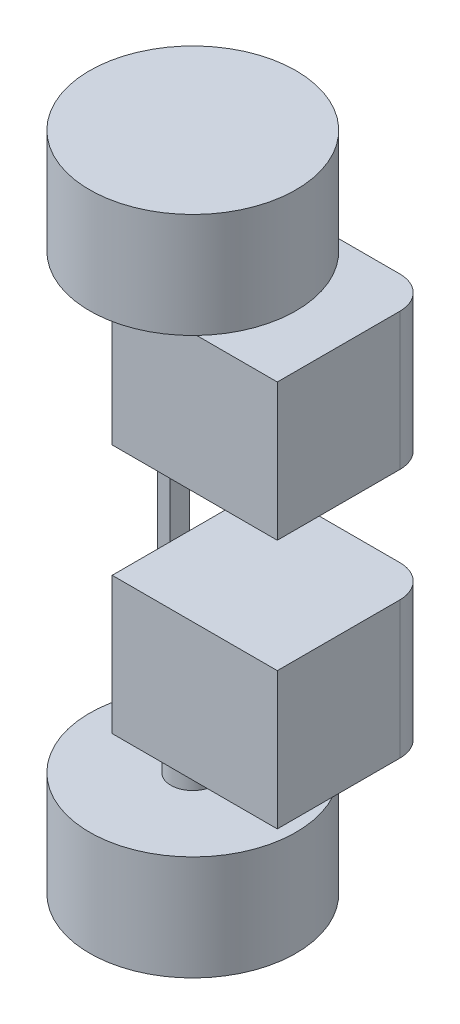
ISO-10303-21;
HEADER;
FILE_DESCRIPTION(('STEP AP214'),'2;1');
FILE_NAME('part.step','',(''),(''),'','','');
FILE_SCHEMA(('AUTOMOTIVE_DESIGN { 1 0 10303 214 1 1 1 1 }'));
ENDSEC;
DATA;
#1=APPLICATION_CONTEXT('core data for automotive mechanical design processes');
#2=APPLICATION_PROTOCOL_DEFINITION('international standard','automotive_design',2000,#1);
#3=PRODUCT_CONTEXT('',#1,'mechanical');
#4=PRODUCT('Part','Part','',(#3));
#5=PRODUCT_RELATED_PRODUCT_CATEGORY('part','',(#4));
#6=PRODUCT_DEFINITION_FORMATION('','',#4);
#7=PRODUCT_DEFINITION_CONTEXT('part definition',#1,'design');
#8=PRODUCT_DEFINITION('design','',#6,#7);
#9=PRODUCT_DEFINITION_SHAPE('','',#8);
#10=(LENGTH_UNIT() NAMED_UNIT(*) SI_UNIT(.MILLI.,.METRE.));
#11=(NAMED_UNIT(*) PLANE_ANGLE_UNIT() SI_UNIT($,.RADIAN.));
#12=(NAMED_UNIT(*) SI_UNIT($,.STERADIAN.) SOLID_ANGLE_UNIT());
#13=UNCERTAINTY_MEASURE_WITH_UNIT(LENGTH_MEASURE(1.E-05),#10,'distance_accuracy_value','');
#14=(GEOMETRIC_REPRESENTATION_CONTEXT(3) GLOBAL_UNCERTAINTY_ASSIGNED_CONTEXT((#13)) GLOBAL_UNIT_ASSIGNED_CONTEXT((#10,
#11,#12)) REPRESENTATION_CONTEXT('',''));
#15=CARTESIAN_POINT('',(0.,0.,0.));
#16=DIRECTION('',(0.,0.,1.));
#17=DIRECTION('',(1.,0.,0.));
#18=AXIS2_PLACEMENT_3D('',#15,#16,#17);
#19=CARTESIAN_POINT('',(0.,0.,0.));
#20=DIRECTION('',(1.,0.,0.));
#21=DIRECTION('',(0.,0.,-1.));
#22=AXIS2_PLACEMENT_3D('',#19,#20,#21);
#23=PLANE('',#22);
#24=DIRECTION('',(0.,1.,0.));
#25=VECTOR('',#24,1.);
#26=CARTESIAN_POINT('',(0.,0.,-18.));
#27=LINE('',#26,#25);
#28=CARTESIAN_POINT('',(0.,42.5,-18.));
#29=VERTEX_POINT('',#28);
#30=CARTESIAN_POINT('',(0.,77.5,-18.));
#31=VERTEX_POINT('',#30);
#32=EDGE_CURVE('E47',#29,#31,#27,.T.);
#33=ORIENTED_EDGE('',*,*,#32,.F.);
#34=DIRECTION('',(0.,0.,1.));
#35=VECTOR('',#34,1.);
#36=CARTESIAN_POINT('',(0.,42.5,-48.));
#37=LINE('',#36,#35);
#38=CARTESIAN_POINT('',(0.,42.5,-24.));
#39=VERTEX_POINT('',#38);
#40=EDGE_CURVE('E587',#39,#29,#37,.T.);
#41=ORIENTED_EDGE('',*,*,#40,.F.);
#42=DIRECTION('',(0.,-1.,0.));
#43=VECTOR('',#42,1.);
#44=CARTESIAN_POINT('',(0.,0.,-24.));
#45=LINE('',#44,#43);
#46=CARTESIAN_POINT('',(0.,77.5,-24.));
#47=VERTEX_POINT('',#46);
#48=EDGE_CURVE('E208',#47,#39,#45,.T.);
#49=ORIENTED_EDGE('',*,*,#48,.F.);
#50=DIRECTION('',(0.,0.,-1.));
#51=VECTOR('',#50,1.);
#52=CARTESIAN_POINT('',(0.,77.5,-48.));
#53=LINE('',#52,#51);
#54=EDGE_CURVE('E229',#31,#47,#53,.T.);
#55=ORIENTED_EDGE('',*,*,#54,.F.);
#56=EDGE_LOOP('',(#33,#41,#49,#55));
#57=FACE_BOUND('',#56,.T.);
#58=ADVANCED_FACE('F36',(#57),#23,.T.);
#59=CARTESIAN_POINT('',(0.,120.,0.));
#60=DIRECTION('',(1.,0.,0.));
#61=DIRECTION('',(0.,0.,-1.));
#62=AXIS2_PLACEMENT_3D('',#59,#60,#61);
#63=PLANE('',#62);
#64=CARTESIAN_POINT('',(0.,120.,-18.));
#65=VERTEX_POINT('',#64);
#66=EDGE_CURVE('E11',#31,#65,#27,.T.);
#67=ORIENTED_EDGE('',*,*,#66,.F.);
#68=CARTESIAN_POINT('',(0.,77.5,0.));
#69=VERTEX_POINT('',#68);
#70=EDGE_CURVE('E226',#69,#31,#53,.T.);
#71=ORIENTED_EDGE('',*,*,#70,.F.);
#72=DIRECTION('',(0.,-1.,0.));
#73=VECTOR('',#72,1.);
#74=CARTESIAN_POINT('',(0.,120.,0.));
#75=LINE('',#74,#73);
#76=CARTESIAN_POINT('',(0.,120.,0.));
#77=VERTEX_POINT('',#76);
#78=EDGE_CURVE('E261',#77,#69,#75,.T.);
#79=ORIENTED_EDGE('',*,*,#78,.F.);
#80=DIRECTION('',(0.,0.,1.));
#81=VECTOR('',#80,1.);
#82=CARTESIAN_POINT('',(0.,120.,0.));
#83=LINE('',#82,#81);
#84=EDGE_CURVE('E54',#65,#77,#83,.T.);
#85=ORIENTED_EDGE('',*,*,#84,.F.);
#86=EDGE_LOOP('',(#67,#71,#79,#85));
#87=FACE_BOUND('',#86,.T.);
#88=ADVANCED_FACE('F305',(#87),#63,.F.);
#89=CARTESIAN_POINT('',(0.,120.,-24.));
#90=VERTEX_POINT('',#89);
#91=EDGE_CURVE('E61',#90,#47,#45,.T.);
#92=ORIENTED_EDGE('',*,*,#91,.F.);
#93=CARTESIAN_POINT('',(0.,120.,-48.));
#94=VERTEX_POINT('',#93);
#95=EDGE_CURVE('E246',#94,#90,#83,.T.);
#96=ORIENTED_EDGE('',*,*,#95,.F.);
#97=DIRECTION('',(0.,-1.,0.));
#98=VECTOR('',#97,1.);
#99=CARTESIAN_POINT('',(0.,120.,-48.));
#100=LINE('',#99,#98);
#101=CARTESIAN_POINT('',(0.,77.5,-48.));
#102=VERTEX_POINT('',#101);
#103=EDGE_CURVE('E255',#94,#102,#100,.T.);
#104=ORIENTED_EDGE('',*,*,#103,.T.);
#105=EDGE_CURVE('E221',#47,#102,#53,.T.);
#106=ORIENTED_EDGE('',*,*,#105,.F.);
#107=EDGE_LOOP('',(#92,#96,#104,#106));
#108=FACE_BOUND('',#107,.T.);
#109=ADVANCED_FACE('F310',(#108),#63,.F.);
#110=CARTESIAN_POINT('',(13.,162.5,-12.));
#111=DIRECTION('',(0.,1.,0.));
#112=DIRECTION('',(0.,0.,-1.));
#113=AXIS2_PLACEMENT_3D('',#110,#111,#112);
#114=PLANE('',#113);
#115=CARTESIAN_POINT('',(13.,162.5,-12.));
#116=DIRECTION('',(0.,-1.,0.));
#117=DIRECTION('',(0.,0.,-1.));
#118=AXIS2_PLACEMENT_3D('',#115,#116,#117);
#119=CIRCLE('',#118,32.);
#120=CARTESIAN_POINT('',(13.,162.5,-44.));
#121=VERTEX_POINT('',#120);
#122=EDGE_CURVE('E235',#121,#121,#119,.T.);
#123=ORIENTED_EDGE('',*,*,#122,.F.);
#124=EDGE_LOOP('',(#123));
#125=FACE_BOUND('',#124,.T.);
#126=ADVANCED_FACE('F312',(#125),#114,.T.);
#127=CARTESIAN_POINT('',(13.,162.5,-12.));
#128=DIRECTION('',(0.,-1.,0.));
#129=DIRECTION('',(0.,0.,-1.));
#130=AXIS2_PLACEMENT_3D('',#127,#128,#129);
#131=CYLINDRICAL_SURFACE('',#130,32.);
#132=ORIENTED_EDGE('',*,*,#122,.T.);
#133=EDGE_LOOP('',(#132));
#134=FACE_BOUND('',#133,.T.);
#135=CARTESIAN_POINT('',(13.,130.,-12.));
#136=DIRECTION('',(0.,-1.,0.));
#137=DIRECTION('',(0.,0.,-1.));
#138=AXIS2_PLACEMENT_3D('',#135,#136,#137);
#139=CIRCLE('',#138,32.);
#140=CARTESIAN_POINT('',(13.,130.,-44.));
#141=VERTEX_POINT('',#140);
#142=EDGE_CURVE('E233',#141,#141,#139,.T.);
#143=ORIENTED_EDGE('',*,*,#142,.F.);
#144=EDGE_LOOP('',(#143));
#145=FACE_BOUND('',#144,.T.);
#146=ADVANCED_FACE('F317',(#134,#145),#131,.T.);
#147=CARTESIAN_POINT('',(13.,130.,-12.));
#148=DIRECTION('',(0.,1.,0.));
#149=DIRECTION('',(0.,0.,-1.));
#150=AXIS2_PLACEMENT_3D('',#147,#148,#149);
#151=PLANE('',#150);
#152=CARTESIAN_POINT('',(13.,130.,-12.));
#153=DIRECTION('',(0.,-1.,0.));
#154=DIRECTION('',(0.,0.,-1.));
#155=AXIS2_PLACEMENT_3D('',#152,#153,#154);
#156=CIRCLE('',#155,6.80386416884808);
#157=CARTESIAN_POINT('',(13.,130.,-18.8038641688481));
#158=VERTEX_POINT('',#157);
#159=EDGE_CURVE('E238',#158,#158,#156,.T.);
#160=ORIENTED_EDGE('',*,*,#159,.F.);
#161=EDGE_LOOP('',(#160));
#162=FACE_BOUND('',#161,.T.);
#163=ORIENTED_EDGE('',*,*,#142,.T.);
#164=EDGE_LOOP('',(#163));
#165=FACE_BOUND('',#164,.T.);
#166=ADVANCED_FACE('F339',(#162,#165),#151,.F.);
#167=CARTESIAN_POINT('',(13.,130.,-12.));
#168=DIRECTION('',(0.,-1.,0.));
#169=DIRECTION('',(0.,0.,-1.));
#170=AXIS2_PLACEMENT_3D('',#167,#168,#169);
#171=CYLINDRICAL_SURFACE('',#170,6.80386416884808);
#172=ORIENTED_EDGE('',*,*,#159,.T.);
#173=EDGE_LOOP('',(#172));
#174=FACE_BOUND('',#173,.T.);
#175=CARTESIAN_POINT('',(13.,120.,-12.));
#176=DIRECTION('',(0.,-1.,0.));
#177=DIRECTION('',(0.,0.,-1.));
#178=AXIS2_PLACEMENT_3D('',#175,#176,#177);
#179=CIRCLE('',#178,6.80386416884808);
#180=CARTESIAN_POINT('',(13.,120.,-18.8038641688481));
#181=VERTEX_POINT('',#180);
#182=EDGE_CURVE('E243',#181,#181,#179,.T.);
#183=ORIENTED_EDGE('',*,*,#182,.F.);
#184=EDGE_LOOP('',(#183));
#185=FACE_BOUND('',#184,.T.);
#186=ADVANCED_FACE('F342',(#174,#185),#171,.T.);
#187=CARTESIAN_POINT('',(0.,120.,0.));
#188=DIRECTION('',(0.,-1.,0.));
#189=DIRECTION('',(0.,0.,-1.));
#190=AXIS2_PLACEMENT_3D('',#187,#188,#189);
#191=PLANE('',#190);
#192=ORIENTED_EDGE('',*,*,#182,.T.);
#193=EDGE_LOOP('',(#192));
#194=FACE_BOUND('',#193,.T.);
#195=DIRECTION('',(0.,0.,-1.));
#196=VECTOR('',#195,1.);
#197=CARTESIAN_POINT('',(51.2,120.,0.));
#198=LINE('',#197,#196);
#199=CARTESIAN_POINT('',(51.2,120.,0.));
#200=VERTEX_POINT('',#199);
#201=CARTESIAN_POINT('',(51.2,120.,-38.));
#202=VERTEX_POINT('',#201);
#203=EDGE_CURVE('E250',#200,#202,#198,.T.);
#204=ORIENTED_EDGE('',*,*,#203,.T.);
#205=CARTESIAN_POINT('',(41.2,120.,-38.));
#206=DIRECTION('',(0.,-1.,0.));
#207=DIRECTION('',(0.,0.,-1.));
#208=AXIS2_PLACEMENT_3D('',#205,#206,#207);
#209=CIRCLE('',#208,10.);
#210=CARTESIAN_POINT('',(41.2,120.,-48.));
#211=VERTEX_POINT('',#210);
#212=EDGE_CURVE('E268',#202,#211,#209,.F.);
#213=ORIENTED_EDGE('',*,*,#212,.T.);
#214=DIRECTION('',(-1.,0.,0.));
#215=VECTOR('',#214,1.);
#216=CARTESIAN_POINT('',(0.,120.,-48.));
#217=LINE('',#216,#215);
#218=EDGE_CURVE('E253',#211,#94,#217,.T.);
#219=ORIENTED_EDGE('',*,*,#218,.T.);
#220=ORIENTED_EDGE('',*,*,#95,.T.);
#221=DIRECTION('',(1.,0.,0.));
#222=VECTOR('',#221,1.);
#223=CARTESIAN_POINT('',(-4.,120.,-24.));
#224=LINE('',#223,#222);
#225=CARTESIAN_POINT('',(-4.,120.,-24.));
#226=VERTEX_POINT('',#225);
#227=EDGE_CURVE('E215',#226,#90,#224,.T.);
#228=ORIENTED_EDGE('',*,*,#227,.F.);
#229=DIRECTION('',(0.,0.,-1.));
#230=VECTOR('',#229,1.);
#231=CARTESIAN_POINT('',(-4.,120.,-24.));
#232=LINE('',#231,#230);
#233=CARTESIAN_POINT('',(-4.,120.,-18.));
#234=VERTEX_POINT('',#233);
#235=EDGE_CURVE('E200',#234,#226,#232,.T.);
#236=ORIENTED_EDGE('',*,*,#235,.F.);
#237=DIRECTION('',(1.,0.,0.));
#238=VECTOR('',#237,1.);
#239=CARTESIAN_POINT('',(-4.,120.,-18.));
#240=LINE('',#239,#238);
#241=EDGE_CURVE('E218',#234,#65,#240,.T.);
#242=ORIENTED_EDGE('',*,*,#241,.T.);
#243=ORIENTED_EDGE('',*,*,#84,.T.);
#244=DIRECTION('',(1.,0.,0.));
#245=VECTOR('',#244,1.);
#246=CARTESIAN_POINT('',(0.,120.,0.));
#247=LINE('',#246,#245);
#248=EDGE_CURVE('E248',#77,#200,#247,.T.);
#249=ORIENTED_EDGE('',*,*,#248,.T.);
#250=EDGE_LOOP('',(#204,#213,#219,#220,#228,#236,#242,#243,#249));
#251=FACE_BOUND('',#250,.T.);
#252=ADVANCED_FACE('F286',(#194,#251),#191,.F.);
#253=CARTESIAN_POINT('',(41.2,120.,-38.));
#254=DIRECTION('',(0.,-1.,0.));
#255=DIRECTION('',(0.,0.,-1.));
#256=AXIS2_PLACEMENT_3D('',#253,#254,#255);
#257=CYLINDRICAL_SURFACE('',#256,10.);
#258=CARTESIAN_POINT('',(41.2,77.5,-38.));
#259=DIRECTION('',(0.,1.,0.));
#260=DIRECTION('',(0.,0.,1.));
#261=AXIS2_PLACEMENT_3D('',#258,#259,#260);
#262=CIRCLE('',#261,10.);
#263=CARTESIAN_POINT('',(41.2,77.5,-48.));
#264=VERTEX_POINT('',#263);
#265=CARTESIAN_POINT('',(51.2,77.5,-38.));
#266=VERTEX_POINT('',#265);
#267=EDGE_CURVE('E40',#264,#266,#262,.F.);
#268=ORIENTED_EDGE('',*,*,#267,.F.);
#269=DIRECTION('',(0.,-1.,0.));
#270=VECTOR('',#269,1.);
#271=CARTESIAN_POINT('',(41.2,120.,-48.));
#272=LINE('',#271,#270);
#273=EDGE_CURVE('E264',#211,#264,#272,.T.);
#274=ORIENTED_EDGE('',*,*,#273,.F.);
#275=ORIENTED_EDGE('',*,*,#212,.F.);
#276=DIRECTION('',(0.,-1.,0.));
#277=VECTOR('',#276,1.);
#278=CARTESIAN_POINT('',(51.2,120.,-38.));
#279=LINE('',#278,#277);
#280=EDGE_CURVE('E267',#266,#202,#279,.F.);
#281=ORIENTED_EDGE('',*,*,#280,.F.);
#282=EDGE_LOOP('',(#268,#274,#275,#281));
#283=FACE_BOUND('',#282,.T.);
#284=ADVANCED_FACE('F38',(#283),#257,.T.);
#285=CARTESIAN_POINT('',(0.,120.,-48.));
#286=DIRECTION('',(0.,0.,1.));
#287=DIRECTION('',(1.,0.,0.));
#288=AXIS2_PLACEMENT_3D('',#285,#286,#287);
#289=PLANE('',#288);
#290=ORIENTED_EDGE('',*,*,#273,.T.);
#291=DIRECTION('',(-1.,0.,0.));
#292=VECTOR('',#291,1.);
#293=CARTESIAN_POINT('',(51.2,77.5,-48.));
#294=LINE('',#293,#292);
#295=EDGE_CURVE('E230',#264,#102,#294,.T.);
#296=ORIENTED_EDGE('',*,*,#295,.T.);
#297=ORIENTED_EDGE('',*,*,#103,.F.);
#298=ORIENTED_EDGE('',*,*,#218,.F.);
#299=EDGE_LOOP('',(#290,#296,#297,#298));
#300=FACE_BOUND('',#299,.T.);
#301=ADVANCED_FACE('F284',(#300),#289,.F.);
#302=CARTESIAN_POINT('',(51.2,120.,0.));
#303=DIRECTION('',(-1.,0.,0.));
#304=DIRECTION('',(0.,0.,1.));
#305=AXIS2_PLACEMENT_3D('',#302,#303,#304);
#306=PLANE('',#305);
#307=DIRECTION('',(0.,-1.,0.));
#308=VECTOR('',#307,1.);
#309=CARTESIAN_POINT('',(51.2,120.,0.));
#310=LINE('',#309,#308);
#311=CARTESIAN_POINT('',(51.2,77.5,0.));
#312=VERTEX_POINT('',#311);
#313=EDGE_CURVE('E258',#200,#312,#310,.T.);
#314=ORIENTED_EDGE('',*,*,#313,.T.);
#315=DIRECTION('',(0.,0.,-1.));
#316=VECTOR('',#315,1.);
#317=CARTESIAN_POINT('',(51.2,77.5,-48.));
#318=LINE('',#317,#316);
#319=EDGE_CURVE('E222',#312,#266,#318,.T.);
#320=ORIENTED_EDGE('',*,*,#319,.T.);
#321=ORIENTED_EDGE('',*,*,#280,.T.);
#322=ORIENTED_EDGE('',*,*,#203,.F.);
#323=EDGE_LOOP('',(#314,#320,#321,#322));
#324=FACE_BOUND('',#323,.T.);
#325=ADVANCED_FACE('F280',(#324),#306,.F.);
#326=CARTESIAN_POINT('',(0.,120.,0.));
#327=DIRECTION('',(0.,0.,-1.));
#328=DIRECTION('',(-1.,0.,0.));
#329=AXIS2_PLACEMENT_3D('',#326,#327,#328);
#330=PLANE('',#329);
#331=ORIENTED_EDGE('',*,*,#78,.T.);
#332=DIRECTION('',(-1.,0.,0.));
#333=VECTOR('',#332,1.);
#334=CARTESIAN_POINT('',(51.2,77.5,0.));
#335=LINE('',#334,#333);
#336=EDGE_CURVE('E225',#312,#69,#335,.T.);
#337=ORIENTED_EDGE('',*,*,#336,.F.);
#338=ORIENTED_EDGE('',*,*,#313,.F.);
#339=ORIENTED_EDGE('',*,*,#248,.F.);
#340=EDGE_LOOP('',(#331,#337,#338,#339));
#341=FACE_BOUND('',#340,.T.);
#342=ADVANCED_FACE('F337',(#341),#330,.F.);
#343=CARTESIAN_POINT('',(51.2,77.5,-48.));
#344=DIRECTION('',(0.,1.,0.));
#345=DIRECTION('',(0.,0.,1.));
#346=AXIS2_PLACEMENT_3D('',#343,#344,#345);
#347=PLANE('',#346);
#348=ORIENTED_EDGE('',*,*,#267,.T.);
#349=ORIENTED_EDGE('',*,*,#319,.F.);
#350=ORIENTED_EDGE('',*,*,#336,.T.);
#351=ORIENTED_EDGE('',*,*,#70,.T.);
#352=ORIENTED_EDGE('',*,*,#54,.T.);
#353=ORIENTED_EDGE('',*,*,#105,.T.);
#354=ORIENTED_EDGE('',*,*,#295,.F.);
#355=EDGE_LOOP('',(#348,#349,#350,#351,#352,#353,#354));
#356=FACE_BOUND('',#355,.T.);
#357=ADVANCED_FACE('F274',(#356),#347,.F.);
#358=CARTESIAN_POINT('',(-4.,0.,-18.));
#359=DIRECTION('',(0.,0.,-1.));
#360=DIRECTION('',(-1.,0.,0.));
#361=AXIS2_PLACEMENT_3D('',#358,#359,#360);
#362=PLANE('',#361);
#363=CARTESIAN_POINT('',(0.,0.,-18.));
#364=VERTEX_POINT('',#363);
#365=EDGE_CURVE('E46',#364,#29,#27,.T.);
#366=ORIENTED_EDGE('',*,*,#365,.T.);
#367=ORIENTED_EDGE('',*,*,#32,.T.);
#368=ORIENTED_EDGE('',*,*,#66,.T.);
#369=ORIENTED_EDGE('',*,*,#241,.F.);
#370=DIRECTION('',(0.,1.,0.));
#371=VECTOR('',#370,1.);
#372=CARTESIAN_POINT('',(-4.,0.,-18.));
#373=LINE('',#372,#371);
#374=CARTESIAN_POINT('',(-4.,0.,-18.));
#375=VERTEX_POINT('',#374);
#376=EDGE_CURVE('E197',#375,#234,#373,.T.);
#377=ORIENTED_EDGE('',*,*,#376,.F.);
#378=DIRECTION('',(1.,0.,0.));
#379=VECTOR('',#378,1.);
#380=CARTESIAN_POINT('',(-4.,0.,-18.));
#381=LINE('',#380,#379);
#382=EDGE_CURVE('E205',#375,#364,#381,.T.);
#383=ORIENTED_EDGE('',*,*,#382,.T.);
#384=EDGE_LOOP('',(#366,#367,#368,#369,#377,#383));
#385=FACE_BOUND('',#384,.T.);
#386=ADVANCED_FACE('F302',(#385),#362,.F.);
#387=CARTESIAN_POINT('',(-4.,0.,-24.));
#388=DIRECTION('',(0.,0.,1.));
#389=DIRECTION('',(0.,-1.,0.));
#390=AXIS2_PLACEMENT_3D('',#387,#388,#389);
#391=PLANE('',#390);
#392=ORIENTED_EDGE('',*,*,#91,.T.);
#393=ORIENTED_EDGE('',*,*,#48,.T.);
#394=DIRECTION('',(0.,1.,0.));
#395=VECTOR('',#394,1.);
#396=CARTESIAN_POINT('',(0.,0.,-24.));
#397=LINE('',#396,#395);
#398=CARTESIAN_POINT('',(0.,0.,-24.));
#399=VERTEX_POINT('',#398);
#400=EDGE_CURVE('E194',#399,#39,#397,.T.);
#401=ORIENTED_EDGE('',*,*,#400,.F.);
#402=DIRECTION('',(1.,0.,0.));
#403=VECTOR('',#402,1.);
#404=CARTESIAN_POINT('',(-4.,0.,-24.));
#405=LINE('',#404,#403);
#406=CARTESIAN_POINT('',(-4.,0.,-24.));
#407=VERTEX_POINT('',#406);
#408=EDGE_CURVE('E212',#407,#399,#405,.T.);
#409=ORIENTED_EDGE('',*,*,#408,.F.);
#410=DIRECTION('',(0.,-1.,0.));
#411=VECTOR('',#410,1.);
#412=CARTESIAN_POINT('',(-4.,0.,-24.));
#413=LINE('',#412,#411);
#414=EDGE_CURVE('E202',#226,#407,#413,.T.);
#415=ORIENTED_EDGE('',*,*,#414,.F.);
#416=ORIENTED_EDGE('',*,*,#227,.T.);
#417=EDGE_LOOP('',(#392,#393,#401,#409,#415,#416));
#418=FACE_BOUND('',#417,.T.);
#419=ADVANCED_FACE('F290',(#418),#391,.F.);
#420=CARTESIAN_POINT('',(-4.,0.,-24.));
#421=DIRECTION('',(0.,1.,0.));
#422=DIRECTION('',(0.,0.,1.));
#423=AXIS2_PLACEMENT_3D('',#420,#421,#422);
#424=PLANE('',#423);
#425=ORIENTED_EDGE('',*,*,#408,.T.);
#426=DIRECTION('',(0.,0.,1.));
#427=VECTOR('',#426,1.);
#428=CARTESIAN_POINT('',(0.,0.,0.));
#429=LINE('',#428,#427);
#430=CARTESIAN_POINT('',(0.,0.,-48.));
#431=VERTEX_POINT('',#430);
#432=EDGE_CURVE('E585',#431,#399,#429,.T.);
#433=ORIENTED_EDGE('',*,*,#432,.F.);
#434=DIRECTION('',(-1.,0.,0.));
#435=VECTOR('',#434,1.);
#436=CARTESIAN_POINT('',(0.,0.,-48.));
#437=LINE('',#436,#435);
#438=CARTESIAN_POINT('',(41.2,0.,-48.));
#439=VERTEX_POINT('',#438);
#440=EDGE_CURVE('E187',#439,#431,#437,.T.);
#441=ORIENTED_EDGE('',*,*,#440,.F.);
#442=CARTESIAN_POINT('',(41.2,0.,-38.));
#443=DIRECTION('',(0.,-1.,0.));
#444=DIRECTION('',(0.,0.,-1.));
#445=AXIS2_PLACEMENT_3D('',#442,#443,#444);
#446=CIRCLE('',#445,10.);
#447=CARTESIAN_POINT('',(51.2,0.,-38.));
#448=VERTEX_POINT('',#447);
#449=EDGE_CURVE('E579',#439,#448,#446,.T.);
#450=ORIENTED_EDGE('',*,*,#449,.T.);
#451=DIRECTION('',(0.,0.,-1.));
#452=VECTOR('',#451,1.);
#453=CARTESIAN_POINT('',(51.2,0.,0.));
#454=LINE('',#453,#452);
#455=CARTESIAN_POINT('',(51.2,0.,0.));
#456=VERTEX_POINT('',#455);
#457=EDGE_CURVE('E178',#456,#448,#454,.T.);
#458=ORIENTED_EDGE('',*,*,#457,.F.);
#459=DIRECTION('',(1.,0.,0.));
#460=VECTOR('',#459,1.);
#461=CARTESIAN_POINT('',(0.,0.,0.));
#462=LINE('',#461,#460);
#463=CARTESIAN_POINT('',(0.,0.,0.));
#464=VERTEX_POINT('',#463);
#465=EDGE_CURVE('E179',#464,#456,#462,.T.);
#466=ORIENTED_EDGE('',*,*,#465,.F.);
#467=EDGE_CURVE('E193',#364,#464,#429,.T.);
#468=ORIENTED_EDGE('',*,*,#467,.F.);
#469=ORIENTED_EDGE('',*,*,#382,.F.);
#470=DIRECTION('',(0.,0.,1.));
#471=VECTOR('',#470,1.);
#472=CARTESIAN_POINT('',(-4.,0.,-24.));
#473=LINE('',#472,#471);
#474=EDGE_CURVE('E204',#407,#375,#473,.T.);
#475=ORIENTED_EDGE('',*,*,#474,.F.);
#476=EDGE_LOOP('',(#425,#433,#441,#450,#458,#466,#468,#469,#475));
#477=FACE_BOUND('',#476,.T.);
#478=CARTESIAN_POINT('',(13.,0.,-12.));
#479=DIRECTION('',(0.,-1.,0.));
#480=DIRECTION('',(0.,0.,-1.));
#481=AXIS2_PLACEMENT_3D('',#478,#479,#480);
#482=CIRCLE('',#481,6.80386416884808);
#483=CARTESIAN_POINT('',(13.,0.,-18.8038641688481));
#484=VERTEX_POINT('',#483);
#485=EDGE_CURVE('E574',#484,#484,#482,.T.);
#486=ORIENTED_EDGE('',*,*,#485,.F.);
#487=EDGE_LOOP('',(#486));
#488=FACE_BOUND('',#487,.T.);
#489=ADVANCED_FACE('F328',(#477,#488),#424,.F.);
#490=CARTESIAN_POINT('',(-4.,0.,0.));
#491=DIRECTION('',(1.,0.,0.));
#492=DIRECTION('',(0.,0.,-1.));
#493=AXIS2_PLACEMENT_3D('',#490,#491,#492);
#494=PLANE('',#493);
#495=ORIENTED_EDGE('',*,*,#376,.T.);
#496=ORIENTED_EDGE('',*,*,#235,.T.);
#497=ORIENTED_EDGE('',*,*,#414,.T.);
#498=ORIENTED_EDGE('',*,*,#474,.T.);
#499=EDGE_LOOP('',(#495,#496,#497,#498));
#500=FACE_BOUND('',#499,.T.);
#501=ADVANCED_FACE('F296',(#500),#494,.F.);
#502=CARTESIAN_POINT('',(0.,120.,0.));
#503=DIRECTION('',(1.,0.,0.));
#504=DIRECTION('',(0.,0.,-1.));
#505=AXIS2_PLACEMENT_3D('',#502,#503,#504);
#506=PLANE('',#505);
#507=CARTESIAN_POINT('',(0.,42.5,0.));
#508=VERTEX_POINT('',#507);
#509=EDGE_CURVE('E584',#29,#508,#37,.T.);
#510=ORIENTED_EDGE('',*,*,#509,.F.);
#511=ORIENTED_EDGE('',*,*,#365,.F.);
#512=ORIENTED_EDGE('',*,*,#467,.T.);
#513=DIRECTION('',(0.,-1.,0.));
#514=VECTOR('',#513,1.);
#515=CARTESIAN_POINT('',(0.,120.,0.));
#516=LINE('',#515,#514);
#517=EDGE_CURVE('E182',#508,#464,#516,.T.);
#518=ORIENTED_EDGE('',*,*,#517,.F.);
#519=EDGE_LOOP('',(#510,#511,#512,#518));
#520=FACE_BOUND('',#519,.T.);
#521=ADVANCED_FACE('F385',(#520),#506,.F.);
#522=ORIENTED_EDGE('',*,*,#432,.T.);
#523=ORIENTED_EDGE('',*,*,#400,.T.);
#524=CARTESIAN_POINT('',(0.,42.5,-48.));
#525=VERTEX_POINT('',#524);
#526=EDGE_CURVE('E196',#525,#39,#37,.T.);
#527=ORIENTED_EDGE('',*,*,#526,.F.);
#528=DIRECTION('',(0.,-1.,0.));
#529=VECTOR('',#528,1.);
#530=CARTESIAN_POINT('',(0.,120.,-48.));
#531=LINE('',#530,#529);
#532=EDGE_CURVE('E191',#525,#431,#531,.T.);
#533=ORIENTED_EDGE('',*,*,#532,.T.);
#534=EDGE_LOOP('',(#522,#523,#527,#533));
#535=FACE_BOUND('',#534,.T.);
#536=ADVANCED_FACE('F391',(#535),#506,.F.);
#537=CARTESIAN_POINT('',(0.,120.,0.));
#538=DIRECTION('',(0.,0.,-1.));
#539=DIRECTION('',(-1.,0.,0.));
#540=AXIS2_PLACEMENT_3D('',#537,#538,#539);
#541=PLANE('',#540);
#542=DIRECTION('',(0.,-1.,0.));
#543=VECTOR('',#542,1.);
#544=CARTESIAN_POINT('',(51.2,120.,0.));
#545=LINE('',#544,#543);
#546=CARTESIAN_POINT('',(51.2,42.5,0.));
#547=VERTEX_POINT('',#546);
#548=EDGE_CURVE('E163',#547,#456,#545,.T.);
#549=ORIENTED_EDGE('',*,*,#548,.F.);
#550=DIRECTION('',(-1.,0.,0.));
#551=VECTOR('',#550,1.);
#552=CARTESIAN_POINT('',(51.2,42.5,0.));
#553=LINE('',#552,#551);
#554=EDGE_CURVE('E159',#547,#508,#553,.T.);
#555=ORIENTED_EDGE('',*,*,#554,.T.);
#556=ORIENTED_EDGE('',*,*,#517,.T.);
#557=ORIENTED_EDGE('',*,*,#465,.T.);
#558=EDGE_LOOP('',(#549,#555,#556,#557));
#559=FACE_BOUND('',#558,.T.);
#560=ADVANCED_FACE('F398',(#559),#541,.F.);
#561=CARTESIAN_POINT('',(51.2,120.,0.));
#562=DIRECTION('',(-1.,0.,0.));
#563=DIRECTION('',(0.,0.,1.));
#564=AXIS2_PLACEMENT_3D('',#561,#562,#563);
#565=PLANE('',#564);
#566=DIRECTION('',(0.,-1.,0.));
#567=VECTOR('',#566,1.);
#568=CARTESIAN_POINT('',(51.2,120.,-38.));
#569=LINE('',#568,#567);
#570=CARTESIAN_POINT('',(51.2,42.5,-38.));
#571=VERTEX_POINT('',#570);
#572=EDGE_CURVE('E164',#448,#571,#569,.F.);
#573=ORIENTED_EDGE('',*,*,#572,.T.);
#574=DIRECTION('',(0.,0.,1.));
#575=VECTOR('',#574,1.);
#576=CARTESIAN_POINT('',(51.2,42.5,-48.));
#577=LINE('',#576,#575);
#578=EDGE_CURVE('E153',#571,#547,#577,.T.);
#579=ORIENTED_EDGE('',*,*,#578,.T.);
#580=ORIENTED_EDGE('',*,*,#548,.T.);
#581=ORIENTED_EDGE('',*,*,#457,.T.);
#582=EDGE_LOOP('',(#573,#579,#580,#581));
#583=FACE_BOUND('',#582,.T.);
#584=ADVANCED_FACE('F176',(#583),#565,.F.);
#585=CARTESIAN_POINT('',(0.,120.,-48.));
#586=DIRECTION('',(0.,0.,1.));
#587=DIRECTION('',(1.,0.,0.));
#588=AXIS2_PLACEMENT_3D('',#585,#586,#587);
#589=PLANE('',#588);
#590=ORIENTED_EDGE('',*,*,#532,.F.);
#591=DIRECTION('',(-1.,0.,0.));
#592=VECTOR('',#591,1.);
#593=CARTESIAN_POINT('',(51.2,42.5,-48.));
#594=LINE('',#593,#592);
#595=CARTESIAN_POINT('',(41.2,42.5,-48.));
#596=VERTEX_POINT('',#595);
#597=EDGE_CURVE('E172',#596,#525,#594,.T.);
#598=ORIENTED_EDGE('',*,*,#597,.F.);
#599=DIRECTION('',(0.,-1.,0.));
#600=VECTOR('',#599,1.);
#601=CARTESIAN_POINT('',(41.2,120.,-48.));
#602=LINE('',#601,#600);
#603=EDGE_CURVE('E171',#596,#439,#602,.T.);
#604=ORIENTED_EDGE('',*,*,#603,.T.);
#605=ORIENTED_EDGE('',*,*,#440,.T.);
#606=EDGE_LOOP('',(#590,#598,#604,#605));
#607=FACE_BOUND('',#606,.T.);
#608=ADVANCED_FACE('F412',(#607),#589,.F.);
#609=CARTESIAN_POINT('',(41.2,120.,-38.));
#610=DIRECTION('',(0.,-1.,0.));
#611=DIRECTION('',(0.,0.,-1.));
#612=AXIS2_PLACEMENT_3D('',#609,#610,#611);
#613=CYLINDRICAL_SURFACE('',#612,10.);
#614=CARTESIAN_POINT('',(41.2,42.5,-38.));
#615=DIRECTION('',(0.,-1.,0.));
#616=DIRECTION('',(0.,0.,-1.));
#617=AXIS2_PLACEMENT_3D('',#614,#615,#616);
#618=CIRCLE('',#617,10.);
#619=EDGE_CURVE('E156',#571,#596,#618,.F.);
#620=ORIENTED_EDGE('',*,*,#619,.F.);
#621=ORIENTED_EDGE('',*,*,#572,.F.);
#622=ORIENTED_EDGE('',*,*,#449,.F.);
#623=ORIENTED_EDGE('',*,*,#603,.F.);
#624=EDGE_LOOP('',(#620,#621,#622,#623));
#625=FACE_BOUND('',#624,.T.);
#626=ADVANCED_FACE('F169',(#625),#613,.T.);
#627=CARTESIAN_POINT('',(13.,-10.,-12.));
#628=DIRECTION('',(0.,1.,0.));
#629=DIRECTION('',(0.,0.,1.));
#630=AXIS2_PLACEMENT_3D('',#627,#628,#629);
#631=CYLINDRICAL_SURFACE('',#630,6.80386416884808);
#632=CARTESIAN_POINT('',(13.,-10.,-12.));
#633=DIRECTION('',(0.,-1.,0.));
#634=DIRECTION('',(0.,0.,-1.));
#635=AXIS2_PLACEMENT_3D('',#632,#633,#634);
#636=CIRCLE('',#635,6.80386416884808);
#637=CARTESIAN_POINT('',(13.,-10.,-18.8038641688481));
#638=VERTEX_POINT('',#637);
#639=EDGE_CURVE('E173',#638,#638,#636,.T.);
#640=ORIENTED_EDGE('',*,*,#639,.F.);
#641=EDGE_LOOP('',(#640));
#642=FACE_BOUND('',#641,.T.);
#643=ORIENTED_EDGE('',*,*,#485,.T.);
#644=EDGE_LOOP('',(#643));
#645=FACE_BOUND('',#644,.T.);
#646=ADVANCED_FACE('F426',(#642,#645),#631,.T.);
#647=CARTESIAN_POINT('',(13.,-42.5,-12.));
#648=DIRECTION('',(0.,1.,0.));
#649=DIRECTION('',(0.,0.,1.));
#650=AXIS2_PLACEMENT_3D('',#647,#648,#649);
#651=CYLINDRICAL_SURFACE('',#650,32.);
#652=CARTESIAN_POINT('',(13.,-42.5,-12.));
#653=DIRECTION('',(0.,-1.,0.));
#654=DIRECTION('',(0.,0.,-1.));
#655=AXIS2_PLACEMENT_3D('',#652,#653,#654);
#656=CIRCLE('',#655,32.);
#657=CARTESIAN_POINT('',(13.,-42.5,-44.));
#658=VERTEX_POINT('',#657);
#659=EDGE_CURVE('E573',#658,#658,#656,.T.);
#660=ORIENTED_EDGE('',*,*,#659,.F.);
#661=EDGE_LOOP('',(#660));
#662=FACE_BOUND('',#661,.T.);
#663=CARTESIAN_POINT('',(13.,-10.,-12.));
#664=DIRECTION('',(0.,-1.,0.));
#665=DIRECTION('',(0.,0.,-1.));
#666=AXIS2_PLACEMENT_3D('',#663,#664,#665);
#667=CIRCLE('',#666,32.);
#668=CARTESIAN_POINT('',(13.,-10.,-44.));
#669=VERTEX_POINT('',#668);
#670=EDGE_CURVE('E571',#669,#669,#667,.T.);
#671=ORIENTED_EDGE('',*,*,#670,.T.);
#672=EDGE_LOOP('',(#671));
#673=FACE_BOUND('',#672,.T.);
#674=ADVANCED_FACE('F433',(#662,#673),#651,.T.);
#675=CARTESIAN_POINT('',(13.,-42.5,-12.));
#676=DIRECTION('',(0.,-1.,0.));
#677=DIRECTION('',(0.,0.,-1.));
#678=AXIS2_PLACEMENT_3D('',#675,#676,#677);
#679=PLANE('',#678);
#680=ORIENTED_EDGE('',*,*,#659,.T.);
#681=EDGE_LOOP('',(#680));
#682=FACE_BOUND('',#681,.T.);
#683=ADVANCED_FACE('F441',(#682),#679,.T.);
#684=CARTESIAN_POINT('',(13.,-10.,-12.));
#685=DIRECTION('',(0.,-1.,0.));
#686=DIRECTION('',(0.,0.,-1.));
#687=AXIS2_PLACEMENT_3D('',#684,#685,#686);
#688=PLANE('',#687);
#689=ORIENTED_EDGE('',*,*,#639,.T.);
#690=EDGE_LOOP('',(#689));
#691=FACE_BOUND('',#690,.T.);
#692=ORIENTED_EDGE('',*,*,#670,.F.);
#693=EDGE_LOOP('',(#692));
#694=FACE_BOUND('',#693,.T.);
#695=ADVANCED_FACE('F449',(#691,#694),#688,.F.);
#696=CARTESIAN_POINT('',(51.2,42.5,-48.));
#697=DIRECTION('',(0.,-1.,0.));
#698=DIRECTION('',(0.,0.,-1.));
#699=AXIS2_PLACEMENT_3D('',#696,#697,#698);
#700=PLANE('',#699);
#701=ORIENTED_EDGE('',*,*,#619,.T.);
#702=ORIENTED_EDGE('',*,*,#597,.T.);
#703=ORIENTED_EDGE('',*,*,#526,.T.);
#704=ORIENTED_EDGE('',*,*,#40,.T.);
#705=ORIENTED_EDGE('',*,*,#509,.T.);
#706=ORIENTED_EDGE('',*,*,#554,.F.);
#707=ORIENTED_EDGE('',*,*,#578,.F.);
#708=EDGE_LOOP('',(#701,#702,#703,#704,#705,#706,#707));
#709=FACE_BOUND('',#708,.T.);
#710=ADVANCED_FACE('F155',(#709),#700,.F.);
#711=CLOSED_SHELL('',(#58,#88,#109,#126,#146,#166,#186,#252,#284,#301,#325,#342,#357,#386,#419,
#489,#501,#521,#536,#560,#584,#608,#626,#646,#674,#683,#695,#710));
#712=MANIFOLD_SOLID_BREP('B2',#711);
#713=ADVANCED_BREP_SHAPE_REPRESENTATION('',(#18,#712),#14);
#714=SHAPE_DEFINITION_REPRESENTATION(#9,#713);
ENDSEC;
END-ISO-10303-21;
